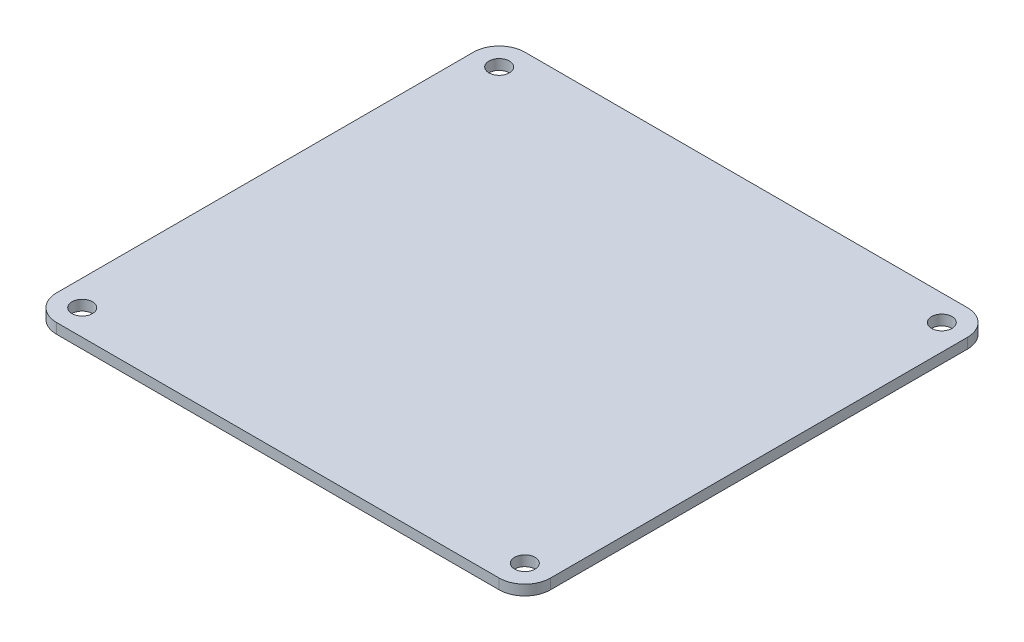
ISO-10303-21;
HEADER;
FILE_DESCRIPTION(('STEP AP214'),'2;1');
FILE_NAME('part.step','',(''),(''),'','','');
FILE_SCHEMA(('AUTOMOTIVE_DESIGN { 1 0 10303 214 1 1 1 1 }'));
ENDSEC;
DATA;
#1=APPLICATION_CONTEXT('core data for automotive mechanical design processes');
#2=APPLICATION_PROTOCOL_DEFINITION('international standard','automotive_design',2000,#1);
#3=PRODUCT_CONTEXT('',#1,'mechanical');
#4=PRODUCT('Part','Part','',(#3));
#5=PRODUCT_RELATED_PRODUCT_CATEGORY('part','',(#4));
#6=PRODUCT_DEFINITION_FORMATION('','',#4);
#7=PRODUCT_DEFINITION_CONTEXT('part definition',#1,'design');
#8=PRODUCT_DEFINITION('design','',#6,#7);
#9=PRODUCT_DEFINITION_SHAPE('','',#8);
#10=(LENGTH_UNIT() NAMED_UNIT(*) SI_UNIT(.MILLI.,.METRE.));
#11=(NAMED_UNIT(*) PLANE_ANGLE_UNIT() SI_UNIT($,.RADIAN.));
#12=(NAMED_UNIT(*) SI_UNIT($,.STERADIAN.) SOLID_ANGLE_UNIT());
#13=UNCERTAINTY_MEASURE_WITH_UNIT(LENGTH_MEASURE(1.E-05),#10,'distance_accuracy_value','');
#14=(GEOMETRIC_REPRESENTATION_CONTEXT(3) GLOBAL_UNCERTAINTY_ASSIGNED_CONTEXT((#13)) GLOBAL_UNIT_ASSIGNED_CONTEXT((#10,
#11,#12)) REPRESENTATION_CONTEXT('',''));
#15=CARTESIAN_POINT('',(0.,0.,0.));
#16=DIRECTION('',(0.,0.,1.));
#17=DIRECTION('',(1.,0.,0.));
#18=AXIS2_PLACEMENT_3D('',#15,#16,#17);
#19=CARTESIAN_POINT('',(0.,1.6,0.));
#20=DIRECTION('',(1.,0.,0.));
#21=DIRECTION('',(0.,0.,-1.));
#22=AXIS2_PLACEMENT_3D('',#19,#20,#21);
#23=PLANE('',#22);
#24=DIRECTION('',(0.,0.,1.));
#25=VECTOR('',#24,1.);
#26=CARTESIAN_POINT('',(0.,0.,0.));
#27=LINE('',#26,#25);
#28=CARTESIAN_POINT('',(0.,0.,-69.));
#29=VERTEX_POINT('',#28);
#30=CARTESIAN_POINT('',(0.,0.,-4.));
#31=VERTEX_POINT('',#30);
#32=EDGE_CURVE('E139',#29,#31,#27,.T.);
#33=ORIENTED_EDGE('',*,*,#32,.T.);
#34=DIRECTION('',(0.,-1.,0.));
#35=VECTOR('',#34,1.);
#36=CARTESIAN_POINT('',(0.,1.6,-4.));
#37=LINE('',#36,#35);
#38=CARTESIAN_POINT('',(0.,1.6,-4.));
#39=VERTEX_POINT('',#38);
#40=EDGE_CURVE('E114',#31,#39,#37,.F.);
#41=ORIENTED_EDGE('',*,*,#40,.T.);
#42=DIRECTION('',(0.,0.,1.));
#43=VECTOR('',#42,1.);
#44=CARTESIAN_POINT('',(0.,1.6,0.));
#45=LINE('',#44,#43);
#46=CARTESIAN_POINT('',(0.,1.6,-69.));
#47=VERTEX_POINT('',#46);
#48=EDGE_CURVE('E152',#47,#39,#45,.T.);
#49=ORIENTED_EDGE('',*,*,#48,.F.);
#50=DIRECTION('',(0.,-1.,0.));
#51=VECTOR('',#50,1.);
#52=CARTESIAN_POINT('',(0.,1.6,-69.));
#53=LINE('',#52,#51);
#54=EDGE_CURVE('E120',#47,#29,#53,.T.);
#55=ORIENTED_EDGE('',*,*,#54,.T.);
#56=EDGE_LOOP('',(#33,#41,#49,#55));
#57=FACE_BOUND('',#56,.T.);
#58=ADVANCED_FACE('F42',(#57),#23,.F.);
#59=CARTESIAN_POINT('',(0.,1.6,0.));
#60=DIRECTION('',(0.,0.,-1.));
#61=DIRECTION('',(-1.,0.,0.));
#62=AXIS2_PLACEMENT_3D('',#59,#60,#61);
#63=PLANE('',#62);
#64=DIRECTION('',(1.,0.,0.));
#65=VECTOR('',#64,1.);
#66=CARTESIAN_POINT('',(0.,1.6,0.));
#67=LINE('',#66,#65);
#68=CARTESIAN_POINT('',(4.,1.6,0.));
#69=VERTEX_POINT('',#68);
#70=CARTESIAN_POINT('',(73.,1.6,0.));
#71=VERTEX_POINT('',#70);
#72=EDGE_CURVE('E130',#69,#71,#67,.T.);
#73=ORIENTED_EDGE('',*,*,#72,.F.);
#74=DIRECTION('',(0.,-1.,0.));
#75=VECTOR('',#74,1.);
#76=CARTESIAN_POINT('',(4.,1.6,0.));
#77=LINE('',#76,#75);
#78=CARTESIAN_POINT('',(4.,0.,0.));
#79=VERTEX_POINT('',#78);
#80=EDGE_CURVE('E113',#69,#79,#77,.T.);
#81=ORIENTED_EDGE('',*,*,#80,.T.);
#82=DIRECTION('',(1.,0.,0.));
#83=VECTOR('',#82,1.);
#84=CARTESIAN_POINT('',(0.,0.,0.));
#85=LINE('',#84,#83);
#86=CARTESIAN_POINT('',(73.,0.,0.));
#87=VERTEX_POINT('',#86);
#88=EDGE_CURVE('E127',#79,#87,#85,.T.);
#89=ORIENTED_EDGE('',*,*,#88,.T.);
#90=DIRECTION('',(0.,-1.,0.));
#91=VECTOR('',#90,1.);
#92=CARTESIAN_POINT('',(73.,1.6,0.));
#93=LINE('',#92,#91);
#94=EDGE_CURVE('E133',#87,#71,#93,.F.);
#95=ORIENTED_EDGE('',*,*,#94,.T.);
#96=EDGE_LOOP('',(#73,#81,#89,#95));
#97=FACE_BOUND('',#96,.T.);
#98=ADVANCED_FACE('F126',(#97),#63,.F.);
#99=CARTESIAN_POINT('',(77.,1.6,0.));
#100=DIRECTION('',(-1.,0.,0.));
#101=DIRECTION('',(0.,0.,1.));
#102=AXIS2_PLACEMENT_3D('',#99,#100,#101);
#103=PLANE('',#102);
#104=DIRECTION('',(0.,0.,-1.));
#105=VECTOR('',#104,1.);
#106=CARTESIAN_POINT('',(77.,1.6,0.));
#107=LINE('',#106,#105);
#108=CARTESIAN_POINT('',(77.,1.6,-4.));
#109=VERTEX_POINT('',#108);
#110=CARTESIAN_POINT('',(77.,1.6,-69.));
#111=VERTEX_POINT('',#110);
#112=EDGE_CURVE('E188',#109,#111,#107,.T.);
#113=ORIENTED_EDGE('',*,*,#112,.F.);
#114=DIRECTION('',(0.,-1.,0.));
#115=VECTOR('',#114,1.);
#116=CARTESIAN_POINT('',(77.,1.6,-4.));
#117=LINE('',#116,#115);
#118=CARTESIAN_POINT('',(77.,0.,-4.));
#119=VERTEX_POINT('',#118);
#120=EDGE_CURVE('E182',#109,#119,#117,.T.);
#121=ORIENTED_EDGE('',*,*,#120,.T.);
#122=DIRECTION('',(0.,0.,-1.));
#123=VECTOR('',#122,1.);
#124=CARTESIAN_POINT('',(77.,0.,0.));
#125=LINE('',#124,#123);
#126=CARTESIAN_POINT('',(77.,0.,-69.));
#127=VERTEX_POINT('',#126);
#128=EDGE_CURVE('E138',#119,#127,#125,.T.);
#129=ORIENTED_EDGE('',*,*,#128,.T.);
#130=DIRECTION('',(0.,-1.,0.));
#131=VECTOR('',#130,1.);
#132=CARTESIAN_POINT('',(77.,1.6,-69.));
#133=LINE('',#132,#131);
#134=EDGE_CURVE('E179',#127,#111,#133,.F.);
#135=ORIENTED_EDGE('',*,*,#134,.T.);
#136=EDGE_LOOP('',(#113,#121,#129,#135));
#137=FACE_BOUND('',#136,.T.);
#138=ADVANCED_FACE('F260',(#137),#103,.F.);
#139=CARTESIAN_POINT('',(0.,1.6,-73.));
#140=DIRECTION('',(0.,0.,1.));
#141=DIRECTION('',(1.,0.,0.));
#142=AXIS2_PLACEMENT_3D('',#139,#140,#141);
#143=PLANE('',#142);
#144=DIRECTION('',(-1.,0.,0.));
#145=VECTOR('',#144,1.);
#146=CARTESIAN_POINT('',(0.,1.6,-73.));
#147=LINE('',#146,#145);
#148=CARTESIAN_POINT('',(73.,1.6,-73.));
#149=VERTEX_POINT('',#148);
#150=CARTESIAN_POINT('',(4.,1.6,-73.));
#151=VERTEX_POINT('',#150);
#152=EDGE_CURVE('E154',#149,#151,#147,.T.);
#153=ORIENTED_EDGE('',*,*,#152,.F.);
#154=DIRECTION('',(0.,-1.,0.));
#155=VECTOR('',#154,1.);
#156=CARTESIAN_POINT('',(73.,1.6,-73.));
#157=LINE('',#156,#155);
#158=CARTESIAN_POINT('',(73.,0.,-73.));
#159=VERTEX_POINT('',#158);
#160=EDGE_CURVE('E11',#149,#159,#157,.T.);
#161=ORIENTED_EDGE('',*,*,#160,.T.);
#162=DIRECTION('',(-1.,0.,0.));
#163=VECTOR('',#162,1.);
#164=CARTESIAN_POINT('',(0.,0.,-73.));
#165=LINE('',#164,#163);
#166=CARTESIAN_POINT('',(4.,0.,-73.));
#167=VERTEX_POINT('',#166);
#168=EDGE_CURVE('E144',#159,#167,#165,.T.);
#169=ORIENTED_EDGE('',*,*,#168,.T.);
#170=DIRECTION('',(0.,-1.,0.));
#171=VECTOR('',#170,1.);
#172=CARTESIAN_POINT('',(4.,1.6,-73.));
#173=LINE('',#172,#171);
#174=EDGE_CURVE('E51',#167,#151,#173,.F.);
#175=ORIENTED_EDGE('',*,*,#174,.T.);
#176=EDGE_LOOP('',(#153,#161,#169,#175));
#177=FACE_BOUND('',#176,.T.);
#178=ADVANCED_FACE('F234',(#177),#143,.F.);
#179=CARTESIAN_POINT('',(0.,1.6,0.));
#180=DIRECTION('',(0.,-1.,0.));
#181=DIRECTION('',(0.,0.,-1.));
#182=AXIS2_PLACEMENT_3D('',#179,#180,#181);
#183=PLANE('',#182);
#184=CARTESIAN_POINT('',(3.99999999999999,1.6,-3.99999999999999));
#185=DIRECTION('',(0.,1.,0.));
#186=DIRECTION('',(0.,0.,1.));
#187=AXIS2_PLACEMENT_3D('',#184,#185,#186);
#188=CIRCLE('',#187,1.6);
#189=CARTESIAN_POINT('',(3.99999999999999,1.6,-2.39999999999999));
#190=VERTEX_POINT('',#189);
#191=EDGE_CURVE('E209',#190,#190,#188,.T.);
#192=ORIENTED_EDGE('',*,*,#191,.F.);
#193=EDGE_LOOP('',(#192));
#194=FACE_BOUND('',#193,.T.);
#195=CARTESIAN_POINT('',(73.,1.6,-3.99999999999999));
#196=DIRECTION('',(0.,1.,0.));
#197=DIRECTION('',(0.,0.,1.));
#198=AXIS2_PLACEMENT_3D('',#195,#196,#197);
#199=CIRCLE('',#198,1.60000000000001);
#200=CARTESIAN_POINT('',(73.,1.6,-2.39999999999998));
#201=VERTEX_POINT('',#200);
#202=EDGE_CURVE('E217',#201,#201,#199,.T.);
#203=ORIENTED_EDGE('',*,*,#202,.F.);
#204=EDGE_LOOP('',(#203));
#205=FACE_BOUND('',#204,.T.);
#206=CARTESIAN_POINT('',(73.,1.6,-69.));
#207=DIRECTION('',(0.,1.,0.));
#208=DIRECTION('',(0.,0.,1.));
#209=AXIS2_PLACEMENT_3D('',#206,#207,#208);
#210=CIRCLE('',#209,1.60000000000001);
#211=CARTESIAN_POINT('',(73.,1.6,-67.4));
#212=VERTEX_POINT('',#211);
#213=EDGE_CURVE('E201',#212,#212,#210,.T.);
#214=ORIENTED_EDGE('',*,*,#213,.F.);
#215=EDGE_LOOP('',(#214));
#216=FACE_BOUND('',#215,.T.);
#217=CARTESIAN_POINT('',(3.99999999999999,1.6,-69.));
#218=DIRECTION('',(0.,1.,0.));
#219=DIRECTION('',(0.,0.,1.));
#220=AXIS2_PLACEMENT_3D('',#217,#218,#219);
#221=CIRCLE('',#220,1.60000000000001);
#222=CARTESIAN_POINT('',(3.99999999999999,1.6,-67.4));
#223=VERTEX_POINT('',#222);
#224=EDGE_CURVE('E197',#223,#223,#221,.T.);
#225=ORIENTED_EDGE('',*,*,#224,.F.);
#226=EDGE_LOOP('',(#225));
#227=FACE_BOUND('',#226,.T.);
#228=ORIENTED_EDGE('',*,*,#48,.T.);
#229=CARTESIAN_POINT('',(4.,1.6,-4.));
#230=DIRECTION('',(0.,-1.,0.));
#231=DIRECTION('',(0.,0.,-1.));
#232=AXIS2_PLACEMENT_3D('',#229,#230,#231);
#233=CIRCLE('',#232,4.);
#234=EDGE_CURVE('E176',#39,#69,#233,.F.);
#235=ORIENTED_EDGE('',*,*,#234,.T.);
#236=ORIENTED_EDGE('',*,*,#72,.T.);
#237=CARTESIAN_POINT('',(73.,1.6,-4.));
#238=DIRECTION('',(0.,-1.,0.));
#239=DIRECTION('',(0.,0.,-1.));
#240=AXIS2_PLACEMENT_3D('',#237,#238,#239);
#241=CIRCLE('',#240,4.);
#242=EDGE_CURVE('E173',#71,#109,#241,.F.);
#243=ORIENTED_EDGE('',*,*,#242,.T.);
#244=ORIENTED_EDGE('',*,*,#112,.T.);
#245=CARTESIAN_POINT('',(73.,1.6,-69.));
#246=DIRECTION('',(0.,-1.,0.));
#247=DIRECTION('',(0.,0.,-1.));
#248=AXIS2_PLACEMENT_3D('',#245,#246,#247);
#249=CIRCLE('',#248,4.);
#250=EDGE_CURVE('E64',#111,#149,#249,.F.);
#251=ORIENTED_EDGE('',*,*,#250,.T.);
#252=ORIENTED_EDGE('',*,*,#152,.T.);
#253=CARTESIAN_POINT('',(4.,1.6,-69.));
#254=DIRECTION('',(0.,-1.,0.));
#255=DIRECTION('',(0.,0.,-1.));
#256=AXIS2_PLACEMENT_3D('',#253,#254,#255);
#257=CIRCLE('',#256,4.);
#258=EDGE_CURVE('E168',#151,#47,#257,.F.);
#259=ORIENTED_EDGE('',*,*,#258,.T.);
#260=EDGE_LOOP('',(#228,#235,#236,#243,#244,#251,#252,#259));
#261=FACE_BOUND('',#260,.T.);
#262=ADVANCED_FACE('F231',(#194,#205,#216,#227,#261),#183,.F.);
#263=CARTESIAN_POINT('',(0.,0.,0.));
#264=DIRECTION('',(0.,-1.,0.));
#265=DIRECTION('',(0.,0.,-1.));
#266=AXIS2_PLACEMENT_3D('',#263,#264,#265);
#267=PLANE('',#266);
#268=CARTESIAN_POINT('',(3.99999999999999,0.,-3.99999999999999));
#269=DIRECTION('',(0.,1.,0.));
#270=DIRECTION('',(0.,0.,1.));
#271=AXIS2_PLACEMENT_3D('',#268,#269,#270);
#272=CIRCLE('',#271,1.6);
#273=CARTESIAN_POINT('',(3.99999999999999,0.,-2.39999999999999));
#274=VERTEX_POINT('',#273);
#275=EDGE_CURVE('E205',#274,#274,#272,.T.);
#276=ORIENTED_EDGE('',*,*,#275,.T.);
#277=EDGE_LOOP('',(#276));
#278=FACE_BOUND('',#277,.T.);
#279=CARTESIAN_POINT('',(73.,0.,-3.99999999999999));
#280=DIRECTION('',(0.,1.,0.));
#281=DIRECTION('',(0.,0.,1.));
#282=AXIS2_PLACEMENT_3D('',#279,#280,#281);
#283=CIRCLE('',#282,1.60000000000001);
#284=CARTESIAN_POINT('',(73.,0.,-2.39999999999998));
#285=VERTEX_POINT('',#284);
#286=EDGE_CURVE('E213',#285,#285,#283,.T.);
#287=ORIENTED_EDGE('',*,*,#286,.T.);
#288=EDGE_LOOP('',(#287));
#289=FACE_BOUND('',#288,.T.);
#290=CARTESIAN_POINT('',(73.,0.,-69.));
#291=DIRECTION('',(0.,1.,0.));
#292=DIRECTION('',(0.,0.,1.));
#293=AXIS2_PLACEMENT_3D('',#290,#291,#292);
#294=CIRCLE('',#293,1.60000000000001);
#295=CARTESIAN_POINT('',(73.,0.,-67.4));
#296=VERTEX_POINT('',#295);
#297=EDGE_CURVE('E221',#296,#296,#294,.T.);
#298=ORIENTED_EDGE('',*,*,#297,.T.);
#299=EDGE_LOOP('',(#298));
#300=FACE_BOUND('',#299,.T.);
#301=CARTESIAN_POINT('',(3.99999999999999,0.,-69.));
#302=DIRECTION('',(0.,1.,0.));
#303=DIRECTION('',(0.,0.,1.));
#304=AXIS2_PLACEMENT_3D('',#301,#302,#303);
#305=CIRCLE('',#304,1.60000000000001);
#306=CARTESIAN_POINT('',(3.99999999999999,0.,-67.4));
#307=VERTEX_POINT('',#306);
#308=EDGE_CURVE('E146',#307,#307,#305,.T.);
#309=ORIENTED_EDGE('',*,*,#308,.T.);
#310=EDGE_LOOP('',(#309));
#311=FACE_BOUND('',#310,.T.);
#312=ORIENTED_EDGE('',*,*,#88,.F.);
#313=CARTESIAN_POINT('',(4.,0.,-4.));
#314=DIRECTION('',(0.,-1.,0.));
#315=DIRECTION('',(0.,0.,-1.));
#316=AXIS2_PLACEMENT_3D('',#313,#314,#315);
#317=CIRCLE('',#316,4.);
#318=EDGE_CURVE('E109',#79,#31,#317,.T.);
#319=ORIENTED_EDGE('',*,*,#318,.T.);
#320=ORIENTED_EDGE('',*,*,#32,.F.);
#321=CARTESIAN_POINT('',(4.,0.,-69.));
#322=DIRECTION('',(0.,-1.,0.));
#323=DIRECTION('',(0.,0.,-1.));
#324=AXIS2_PLACEMENT_3D('',#321,#322,#323);
#325=CIRCLE('',#324,4.);
#326=EDGE_CURVE('E132',#29,#167,#325,.T.);
#327=ORIENTED_EDGE('',*,*,#326,.T.);
#328=ORIENTED_EDGE('',*,*,#168,.F.);
#329=CARTESIAN_POINT('',(73.,0.,-69.));
#330=DIRECTION('',(0.,-1.,0.));
#331=DIRECTION('',(0.,0.,-1.));
#332=AXIS2_PLACEMENT_3D('',#329,#330,#331);
#333=CIRCLE('',#332,4.);
#334=EDGE_CURVE('E158',#159,#127,#333,.T.);
#335=ORIENTED_EDGE('',*,*,#334,.T.);
#336=ORIENTED_EDGE('',*,*,#128,.F.);
#337=CARTESIAN_POINT('',(73.,0.,-4.));
#338=DIRECTION('',(0.,-1.,0.));
#339=DIRECTION('',(0.,0.,-1.));
#340=AXIS2_PLACEMENT_3D('',#337,#338,#339);
#341=CIRCLE('',#340,4.);
#342=EDGE_CURVE('E121',#119,#87,#341,.T.);
#343=ORIENTED_EDGE('',*,*,#342,.T.);
#344=EDGE_LOOP('',(#312,#319,#320,#327,#328,#335,#336,#343));
#345=FACE_BOUND('',#344,.T.);
#346=ADVANCED_FACE('F135',(#278,#289,#300,#311,#345),#267,.T.);
#347=CARTESIAN_POINT('',(4.,1.6,-4.));
#348=DIRECTION('',(0.,-1.,0.));
#349=DIRECTION('',(0.,0.,-1.));
#350=AXIS2_PLACEMENT_3D('',#347,#348,#349);
#351=CYLINDRICAL_SURFACE('',#350,4.);
#352=ORIENTED_EDGE('',*,*,#234,.F.);
#353=ORIENTED_EDGE('',*,*,#40,.F.);
#354=ORIENTED_EDGE('',*,*,#318,.F.);
#355=ORIENTED_EDGE('',*,*,#80,.F.);
#356=EDGE_LOOP('',(#352,#353,#354,#355));
#357=FACE_BOUND('',#356,.T.);
#358=ADVANCED_FACE('F112',(#357),#351,.T.);
#359=CARTESIAN_POINT('',(73.,1.6,-4.));
#360=DIRECTION('',(0.,-1.,0.));
#361=DIRECTION('',(0.,0.,-1.));
#362=AXIS2_PLACEMENT_3D('',#359,#360,#361);
#363=CYLINDRICAL_SURFACE('',#362,4.);
#364=ORIENTED_EDGE('',*,*,#242,.F.);
#365=ORIENTED_EDGE('',*,*,#94,.F.);
#366=ORIENTED_EDGE('',*,*,#342,.F.);
#367=ORIENTED_EDGE('',*,*,#120,.F.);
#368=EDGE_LOOP('',(#364,#365,#366,#367));
#369=FACE_BOUND('',#368,.T.);
#370=ADVANCED_FACE('F266',(#369),#363,.T.);
#371=CARTESIAN_POINT('',(73.,1.6,-69.));
#372=DIRECTION('',(0.,-1.,0.));
#373=DIRECTION('',(0.,0.,-1.));
#374=AXIS2_PLACEMENT_3D('',#371,#372,#373);
#375=CYLINDRICAL_SURFACE('',#374,4.);
#376=ORIENTED_EDGE('',*,*,#250,.F.);
#377=ORIENTED_EDGE('',*,*,#134,.F.);
#378=ORIENTED_EDGE('',*,*,#334,.F.);
#379=ORIENTED_EDGE('',*,*,#160,.F.);
#380=EDGE_LOOP('',(#376,#377,#378,#379));
#381=FACE_BOUND('',#380,.T.);
#382=ADVANCED_FACE('F250',(#381),#375,.T.);
#383=CARTESIAN_POINT('',(4.,1.6,-69.));
#384=DIRECTION('',(0.,-1.,0.));
#385=DIRECTION('',(0.,0.,-1.));
#386=AXIS2_PLACEMENT_3D('',#383,#384,#385);
#387=CYLINDRICAL_SURFACE('',#386,4.);
#388=ORIENTED_EDGE('',*,*,#258,.F.);
#389=ORIENTED_EDGE('',*,*,#174,.F.);
#390=ORIENTED_EDGE('',*,*,#326,.F.);
#391=ORIENTED_EDGE('',*,*,#54,.F.);
#392=EDGE_LOOP('',(#388,#389,#390,#391));
#393=FACE_BOUND('',#392,.T.);
#394=ADVANCED_FACE('F44',(#393),#387,.T.);
#395=CARTESIAN_POINT('',(3.99999999999999,0.,-69.));
#396=DIRECTION('',(0.,1.,0.));
#397=DIRECTION('',(0.,0.,1.));
#398=AXIS2_PLACEMENT_3D('',#395,#396,#397);
#399=CYLINDRICAL_SURFACE('',#398,1.60000000000001);
#400=ORIENTED_EDGE('',*,*,#308,.F.);
#401=EDGE_LOOP('',(#400));
#402=FACE_BOUND('',#401,.T.);
#403=ORIENTED_EDGE('',*,*,#224,.T.);
#404=EDGE_LOOP('',(#403));
#405=FACE_BOUND('',#404,.T.);
#406=ADVANCED_FACE('F239',(#402,#405),#399,.F.);
#407=CARTESIAN_POINT('',(73.,0.,-69.));
#408=DIRECTION('',(0.,1.,0.));
#409=DIRECTION('',(0.,0.,1.));
#410=AXIS2_PLACEMENT_3D('',#407,#408,#409);
#411=CYLINDRICAL_SURFACE('',#410,1.60000000000001);
#412=ORIENTED_EDGE('',*,*,#297,.F.);
#413=EDGE_LOOP('',(#412));
#414=FACE_BOUND('',#413,.T.);
#415=ORIENTED_EDGE('',*,*,#213,.T.);
#416=EDGE_LOOP('',(#415));
#417=FACE_BOUND('',#416,.T.);
#418=ADVANCED_FACE('F229',(#414,#417),#411,.F.);
#419=CARTESIAN_POINT('',(73.,0.,-3.99999999999999));
#420=DIRECTION('',(0.,1.,0.));
#421=DIRECTION('',(0.,0.,1.));
#422=AXIS2_PLACEMENT_3D('',#419,#420,#421);
#423=CYLINDRICAL_SURFACE('',#422,1.60000000000001);
#424=ORIENTED_EDGE('',*,*,#286,.F.);
#425=EDGE_LOOP('',(#424));
#426=FACE_BOUND('',#425,.T.);
#427=ORIENTED_EDGE('',*,*,#202,.T.);
#428=EDGE_LOOP('',(#427));
#429=FACE_BOUND('',#428,.T.);
#430=ADVANCED_FACE('F247',(#426,#429),#423,.F.);
#431=CARTESIAN_POINT('',(3.99999999999999,0.,-3.99999999999999));
#432=DIRECTION('',(0.,1.,0.));
#433=DIRECTION('',(0.,0.,1.));
#434=AXIS2_PLACEMENT_3D('',#431,#432,#433);
#435=CYLINDRICAL_SURFACE('',#434,1.6);
#436=ORIENTED_EDGE('',*,*,#275,.F.);
#437=EDGE_LOOP('',(#436));
#438=FACE_BOUND('',#437,.T.);
#439=ORIENTED_EDGE('',*,*,#191,.T.);
#440=EDGE_LOOP('',(#439));
#441=FACE_BOUND('',#440,.T.);
#442=ADVANCED_FACE('F301',(#438,#441),#435,.F.);
#443=CLOSED_SHELL('',(#58,#98,#138,#178,#262,#346,#358,#370,#382,#394,#406,#418,#430,#442));
#444=MANIFOLD_SOLID_BREP('B2',#443);
#445=ADVANCED_BREP_SHAPE_REPRESENTATION('',(#18,#444),#14);
#446=SHAPE_DEFINITION_REPRESENTATION(#9,#445);
ENDSEC;
END-ISO-10303-21;
